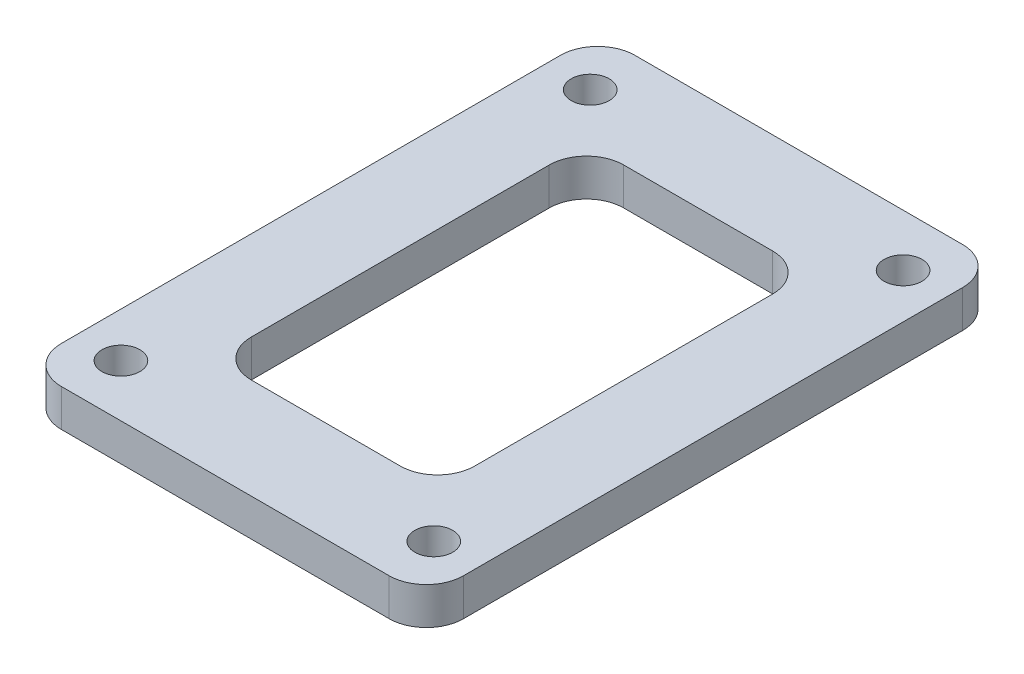
ISO-10303-21;
HEADER;
FILE_DESCRIPTION(('STEP AP214'),'2;1');
FILE_NAME('part.step','',(''),(''),'','','');
FILE_SCHEMA(('AUTOMOTIVE_DESIGN { 1 0 10303 214 1 1 1 1 }'));
ENDSEC;
DATA;
#1=APPLICATION_CONTEXT('core data for automotive mechanical design processes');
#2=APPLICATION_PROTOCOL_DEFINITION('international standard','automotive_design',2000,#1);
#3=PRODUCT_CONTEXT('',#1,'mechanical');
#4=PRODUCT('Part','Part','',(#3));
#5=PRODUCT_RELATED_PRODUCT_CATEGORY('part','',(#4));
#6=PRODUCT_DEFINITION_FORMATION('','',#4);
#7=PRODUCT_DEFINITION_CONTEXT('part definition',#1,'design');
#8=PRODUCT_DEFINITION('design','',#6,#7);
#9=PRODUCT_DEFINITION_SHAPE('','',#8);
#10=(LENGTH_UNIT() NAMED_UNIT(*) SI_UNIT(.MILLI.,.METRE.));
#11=(NAMED_UNIT(*) PLANE_ANGLE_UNIT() SI_UNIT($,.RADIAN.));
#12=(NAMED_UNIT(*) SI_UNIT($,.STERADIAN.) SOLID_ANGLE_UNIT());
#13=UNCERTAINTY_MEASURE_WITH_UNIT(LENGTH_MEASURE(1.E-05),#10,'distance_accuracy_value','');
#14=(GEOMETRIC_REPRESENTATION_CONTEXT(3) GLOBAL_UNCERTAINTY_ASSIGNED_CONTEXT((#13)) GLOBAL_UNIT_ASSIGNED_CONTEXT((#10,
#11,#12)) REPRESENTATION_CONTEXT('',''));
#15=CARTESIAN_POINT('',(0.,0.,0.));
#16=DIRECTION('',(0.,0.,1.));
#17=DIRECTION('',(1.,0.,0.));
#18=AXIS2_PLACEMENT_3D('',#15,#16,#17);
#19=CARTESIAN_POINT('',(27.,5.,-38.5));
#20=DIRECTION('',(-1.,0.,0.));
#21=DIRECTION('',(0.,0.,1.));
#22=AXIS2_PLACEMENT_3D('',#19,#20,#21);
#23=PLANE('',#22);
#24=DIRECTION('',(0.,0.,-1.));
#25=VECTOR('',#24,1.);
#26=CARTESIAN_POINT('',(27.,5.,-38.5));
#27=LINE('',#26,#25);
#28=CARTESIAN_POINT('',(27.,5.,33.5));
#29=VERTEX_POINT('',#28);
#30=CARTESIAN_POINT('',(27.,5.,-33.5));
#31=VERTEX_POINT('',#30);
#32=EDGE_CURVE('E202',#29,#31,#27,.T.);
#33=ORIENTED_EDGE('',*,*,#32,.F.);
#34=DIRECTION('',(0.,-1.,0.));
#35=VECTOR('',#34,1.);
#36=CARTESIAN_POINT('',(27.,5.,33.5));
#37=LINE('',#36,#35);
#38=CARTESIAN_POINT('',(27.,0.,33.5));
#39=VERTEX_POINT('',#38);
#40=EDGE_CURVE('E250',#29,#39,#37,.T.);
#41=ORIENTED_EDGE('',*,*,#40,.T.);
#42=DIRECTION('',(0.,0.,-1.));
#43=VECTOR('',#42,1.);
#44=CARTESIAN_POINT('',(27.,0.,-38.5));
#45=LINE('',#44,#43);
#46=CARTESIAN_POINT('',(27.,0.,-33.5));
#47=VERTEX_POINT('',#46);
#48=EDGE_CURVE('E199',#39,#47,#45,.T.);
#49=ORIENTED_EDGE('',*,*,#48,.T.);
#50=DIRECTION('',(0.,-1.,0.));
#51=VECTOR('',#50,1.);
#52=CARTESIAN_POINT('',(27.,5.,-33.5));
#53=LINE('',#52,#51);
#54=EDGE_CURVE('E248',#47,#31,#53,.F.);
#55=ORIENTED_EDGE('',*,*,#54,.T.);
#56=EDGE_LOOP('',(#33,#41,#49,#55));
#57=FACE_BOUND('',#56,.T.);
#58=ADVANCED_FACE('F37',(#57),#23,.F.);
#59=CARTESIAN_POINT('',(-27.,5.,-38.5));
#60=DIRECTION('',(0.,0.,1.));
#61=DIRECTION('',(1.,0.,0.));
#62=AXIS2_PLACEMENT_3D('',#59,#60,#61);
#63=PLANE('',#62);
#64=DIRECTION('',(-1.,0.,0.));
#65=VECTOR('',#64,1.);
#66=CARTESIAN_POINT('',(-27.,5.,-38.5));
#67=LINE('',#66,#65);
#68=CARTESIAN_POINT('',(22.,5.,-38.5));
#69=VERTEX_POINT('',#68);
#70=CARTESIAN_POINT('',(-22.,5.,-38.5));
#71=VERTEX_POINT('',#70);
#72=EDGE_CURVE('E205',#69,#71,#67,.T.);
#73=ORIENTED_EDGE('',*,*,#72,.F.);
#74=DIRECTION('',(0.,-1.,0.));
#75=VECTOR('',#74,1.);
#76=CARTESIAN_POINT('',(22.,5.,-38.5));
#77=LINE('',#76,#75);
#78=CARTESIAN_POINT('',(22.,0.,-38.5));
#79=VERTEX_POINT('',#78);
#80=EDGE_CURVE('E162',#69,#79,#77,.T.);
#81=ORIENTED_EDGE('',*,*,#80,.T.);
#82=DIRECTION('',(-1.,0.,0.));
#83=VECTOR('',#82,1.);
#84=CARTESIAN_POINT('',(-27.,0.,-38.5));
#85=LINE('',#84,#83);
#86=CARTESIAN_POINT('',(-22.,0.,-38.5));
#87=VERTEX_POINT('',#86);
#88=EDGE_CURVE('E216',#79,#87,#85,.T.);
#89=ORIENTED_EDGE('',*,*,#88,.T.);
#90=DIRECTION('',(0.,-1.,0.));
#91=VECTOR('',#90,1.);
#92=CARTESIAN_POINT('',(-22.,5.,-38.5));
#93=LINE('',#92,#91);
#94=EDGE_CURVE('E277',#87,#71,#93,.F.);
#95=ORIENTED_EDGE('',*,*,#94,.T.);
#96=EDGE_LOOP('',(#73,#81,#89,#95));
#97=FACE_BOUND('',#96,.T.);
#98=ADVANCED_FACE('F335',(#97),#63,.F.);
#99=CARTESIAN_POINT('',(-27.,5.,-38.5));
#100=DIRECTION('',(1.,0.,0.));
#101=DIRECTION('',(0.,0.,-1.));
#102=AXIS2_PLACEMENT_3D('',#99,#100,#101);
#103=PLANE('',#102);
#104=DIRECTION('',(0.,0.,1.));
#105=VECTOR('',#104,1.);
#106=CARTESIAN_POINT('',(-27.,0.,-38.5));
#107=LINE('',#106,#105);
#108=CARTESIAN_POINT('',(-27.,0.,-33.5));
#109=VERTEX_POINT('',#108);
#110=CARTESIAN_POINT('',(-27.,0.,33.5));
#111=VERTEX_POINT('',#110);
#112=EDGE_CURVE('E219',#109,#111,#107,.T.);
#113=ORIENTED_EDGE('',*,*,#112,.T.);
#114=DIRECTION('',(0.,-1.,0.));
#115=VECTOR('',#114,1.);
#116=CARTESIAN_POINT('',(-27.,5.,33.5));
#117=LINE('',#116,#115);
#118=CARTESIAN_POINT('',(-27.,5.,33.5));
#119=VERTEX_POINT('',#118);
#120=EDGE_CURVE('E52',#111,#119,#117,.F.);
#121=ORIENTED_EDGE('',*,*,#120,.T.);
#122=DIRECTION('',(0.,0.,1.));
#123=VECTOR('',#122,1.);
#124=CARTESIAN_POINT('',(-27.,5.,-38.5));
#125=LINE('',#124,#123);
#126=CARTESIAN_POINT('',(-27.,5.,-33.5));
#127=VERTEX_POINT('',#126);
#128=EDGE_CURVE('E208',#127,#119,#125,.T.);
#129=ORIENTED_EDGE('',*,*,#128,.F.);
#130=DIRECTION('',(0.,-1.,0.));
#131=VECTOR('',#130,1.);
#132=CARTESIAN_POINT('',(-27.,5.,-33.5));
#133=LINE('',#132,#131);
#134=EDGE_CURVE('E273',#127,#109,#133,.T.);
#135=ORIENTED_EDGE('',*,*,#134,.T.);
#136=EDGE_LOOP('',(#113,#121,#129,#135));
#137=FACE_BOUND('',#136,.T.);
#138=ADVANCED_FACE('F342',(#137),#103,.F.);
#139=CARTESIAN_POINT('',(-27.,5.,38.5));
#140=DIRECTION('',(0.,0.,-1.));
#141=DIRECTION('',(-1.,0.,0.));
#142=AXIS2_PLACEMENT_3D('',#139,#140,#141);
#143=PLANE('',#142);
#144=DIRECTION('',(1.,0.,0.));
#145=VECTOR('',#144,1.);
#146=CARTESIAN_POINT('',(-27.,0.,38.5));
#147=LINE('',#146,#145);
#148=CARTESIAN_POINT('',(-22.,0.,38.5));
#149=VERTEX_POINT('',#148);
#150=CARTESIAN_POINT('',(22.,0.,38.5));
#151=VERTEX_POINT('',#150);
#152=EDGE_CURVE('E206',#149,#151,#147,.T.);
#153=ORIENTED_EDGE('',*,*,#152,.T.);
#154=DIRECTION('',(0.,-1.,0.));
#155=VECTOR('',#154,1.);
#156=CARTESIAN_POINT('',(22.,5.,38.5));
#157=LINE('',#156,#155);
#158=CARTESIAN_POINT('',(22.,5.,38.5));
#159=VERTEX_POINT('',#158);
#160=EDGE_CURVE('E264',#151,#159,#157,.F.);
#161=ORIENTED_EDGE('',*,*,#160,.T.);
#162=DIRECTION('',(1.,0.,0.));
#163=VECTOR('',#162,1.);
#164=CARTESIAN_POINT('',(-27.,5.,38.5));
#165=LINE('',#164,#163);
#166=CARTESIAN_POINT('',(-22.,5.,38.5));
#167=VERTEX_POINT('',#166);
#168=EDGE_CURVE('E210',#167,#159,#165,.T.);
#169=ORIENTED_EDGE('',*,*,#168,.F.);
#170=DIRECTION('',(0.,-1.,0.));
#171=VECTOR('',#170,1.);
#172=CARTESIAN_POINT('',(-22.,5.,38.5));
#173=LINE('',#172,#171);
#174=EDGE_CURVE('E261',#167,#149,#173,.T.);
#175=ORIENTED_EDGE('',*,*,#174,.T.);
#176=EDGE_LOOP('',(#153,#161,#169,#175));
#177=FACE_BOUND('',#176,.T.);
#178=ADVANCED_FACE('F378',(#177),#143,.F.);
#179=CARTESIAN_POINT('',(0.,5.,0.));
#180=DIRECTION('',(0.,1.,0.));
#181=DIRECTION('',(0.,0.,1.));
#182=AXIS2_PLACEMENT_3D('',#179,#180,#181);
#183=PLANE('',#182);
#184=DIRECTION('',(0.,0.,-1.));
#185=VECTOR('',#184,1.);
#186=CARTESIAN_POINT('',(15.,5.,25.));
#187=LINE('',#186,#185);
#188=CARTESIAN_POINT('',(15.,5.,20.));
#189=VERTEX_POINT('',#188);
#190=CARTESIAN_POINT('',(15.,5.,-20.));
#191=VERTEX_POINT('',#190);
#192=EDGE_CURVE('E298',#189,#191,#187,.T.);
#193=ORIENTED_EDGE('',*,*,#192,.F.);
#194=CARTESIAN_POINT('',(9.99999999999999,5.,20.));
#195=DIRECTION('',(0.,1.,0.));
#196=DIRECTION('',(0.,0.,1.));
#197=AXIS2_PLACEMENT_3D('',#194,#195,#196);
#198=CIRCLE('',#197,5.);
#199=CARTESIAN_POINT('',(9.99999999999999,5.,25.));
#200=VERTEX_POINT('',#199);
#201=EDGE_CURVE('E178',#189,#200,#198,.F.);
#202=ORIENTED_EDGE('',*,*,#201,.T.);
#203=DIRECTION('',(1.,0.,0.));
#204=VECTOR('',#203,1.);
#205=CARTESIAN_POINT('',(-15.,5.,25.));
#206=LINE('',#205,#204);
#207=CARTESIAN_POINT('',(-10.,5.,25.));
#208=VERTEX_POINT('',#207);
#209=EDGE_CURVE('E168',#208,#200,#206,.T.);
#210=ORIENTED_EDGE('',*,*,#209,.F.);
#211=CARTESIAN_POINT('',(-10.,5.,20.));
#212=DIRECTION('',(0.,1.,0.));
#213=DIRECTION('',(0.,0.,1.));
#214=AXIS2_PLACEMENT_3D('',#211,#212,#213);
#215=CIRCLE('',#214,5.);
#216=CARTESIAN_POINT('',(-15.,5.,20.));
#217=VERTEX_POINT('',#216);
#218=EDGE_CURVE('E151',#208,#217,#215,.F.);
#219=ORIENTED_EDGE('',*,*,#218,.T.);
#220=DIRECTION('',(0.,0.,1.));
#221=VECTOR('',#220,1.);
#222=CARTESIAN_POINT('',(-15.,5.,25.));
#223=LINE('',#222,#221);
#224=CARTESIAN_POINT('',(-15.,5.,-20.));
#225=VERTEX_POINT('',#224);
#226=EDGE_CURVE('E180',#225,#217,#223,.T.);
#227=ORIENTED_EDGE('',*,*,#226,.F.);
#228=CARTESIAN_POINT('',(-10.,5.,-20.));
#229=DIRECTION('',(0.,1.,0.));
#230=DIRECTION('',(0.,0.,1.));
#231=AXIS2_PLACEMENT_3D('',#228,#229,#230);
#232=CIRCLE('',#231,5.);
#233=CARTESIAN_POINT('',(-10.,5.,-25.));
#234=VERTEX_POINT('',#233);
#235=EDGE_CURVE('E45',#225,#234,#232,.F.);
#236=ORIENTED_EDGE('',*,*,#235,.T.);
#237=DIRECTION('',(-1.,0.,0.));
#238=VECTOR('',#237,1.);
#239=CARTESIAN_POINT('',(-15.,5.,-25.));
#240=LINE('',#239,#238);
#241=CARTESIAN_POINT('',(9.99999999999999,5.,-25.));
#242=VERTEX_POINT('',#241);
#243=EDGE_CURVE('E185',#242,#234,#240,.T.);
#244=ORIENTED_EDGE('',*,*,#243,.F.);
#245=CARTESIAN_POINT('',(9.99999999999999,5.,-20.));
#246=DIRECTION('',(0.,1.,0.));
#247=DIRECTION('',(0.,0.,1.));
#248=AXIS2_PLACEMENT_3D('',#245,#246,#247);
#249=CIRCLE('',#248,5.);
#250=EDGE_CURVE('E282',#242,#191,#249,.F.);
#251=ORIENTED_EDGE('',*,*,#250,.T.);
#252=EDGE_LOOP('',(#193,#202,#210,#219,#227,#236,#244,#251));
#253=FACE_BOUND('',#252,.T.);
#254=CARTESIAN_POINT('',(21.,5.,-31.5));
#255=DIRECTION('',(0.,1.,0.));
#256=DIRECTION('',(0.,0.,1.));
#257=AXIS2_PLACEMENT_3D('',#254,#255,#256);
#258=CIRCLE('',#257,2.55);
#259=CARTESIAN_POINT('',(21.,5.,-28.95));
#260=VERTEX_POINT('',#259);
#261=EDGE_CURVE('E192',#260,#260,#258,.T.);
#262=ORIENTED_EDGE('',*,*,#261,.F.);
#263=EDGE_LOOP('',(#262));
#264=FACE_BOUND('',#263,.T.);
#265=CARTESIAN_POINT('',(-21.,5.,-31.5));
#266=DIRECTION('',(0.,1.,0.));
#267=DIRECTION('',(0.,0.,1.));
#268=AXIS2_PLACEMENT_3D('',#265,#266,#267);
#269=CIRCLE('',#268,2.55);
#270=CARTESIAN_POINT('',(-21.,5.,-28.95));
#271=VERTEX_POINT('',#270);
#272=EDGE_CURVE('E195',#271,#271,#269,.T.);
#273=ORIENTED_EDGE('',*,*,#272,.F.);
#274=EDGE_LOOP('',(#273));
#275=FACE_BOUND('',#274,.T.);
#276=ORIENTED_EDGE('',*,*,#168,.T.);
#277=CARTESIAN_POINT('',(22.,5.,33.5));
#278=DIRECTION('',(0.,1.,0.));
#279=DIRECTION('',(0.,0.,1.));
#280=AXIS2_PLACEMENT_3D('',#277,#278,#279);
#281=CIRCLE('',#280,5.);
#282=EDGE_CURVE('E271',#159,#29,#281,.T.);
#283=ORIENTED_EDGE('',*,*,#282,.T.);
#284=ORIENTED_EDGE('',*,*,#32,.T.);
#285=CARTESIAN_POINT('',(22.,5.,-33.5));
#286=DIRECTION('',(0.,1.,0.));
#287=DIRECTION('',(0.,0.,1.));
#288=AXIS2_PLACEMENT_3D('',#285,#286,#287);
#289=CIRCLE('',#288,5.);
#290=EDGE_CURVE('E267',#31,#69,#289,.T.);
#291=ORIENTED_EDGE('',*,*,#290,.T.);
#292=ORIENTED_EDGE('',*,*,#72,.T.);
#293=CARTESIAN_POINT('',(-22.,5.,-33.5));
#294=DIRECTION('',(0.,1.,0.));
#295=DIRECTION('',(0.,0.,1.));
#296=AXIS2_PLACEMENT_3D('',#293,#294,#295);
#297=CIRCLE('',#296,5.);
#298=EDGE_CURVE('E59',#71,#127,#297,.T.);
#299=ORIENTED_EDGE('',*,*,#298,.T.);
#300=ORIENTED_EDGE('',*,*,#128,.T.);
#301=CARTESIAN_POINT('',(-22.,5.,33.5));
#302=DIRECTION('',(0.,1.,0.));
#303=DIRECTION('',(0.,0.,1.));
#304=AXIS2_PLACEMENT_3D('',#301,#302,#303);
#305=CIRCLE('',#304,5.);
#306=EDGE_CURVE('E269',#119,#167,#305,.T.);
#307=ORIENTED_EDGE('',*,*,#306,.T.);
#308=EDGE_LOOP('',(#276,#283,#284,#291,#292,#299,#300,#307));
#309=FACE_BOUND('',#308,.T.);
#310=CARTESIAN_POINT('',(-21.,5.,31.5));
#311=DIRECTION('',(0.,1.,0.));
#312=DIRECTION('',(0.,0.,1.));
#313=AXIS2_PLACEMENT_3D('',#310,#311,#312);
#314=CIRCLE('',#313,2.55);
#315=CARTESIAN_POINT('',(-21.,5.,34.05));
#316=VERTEX_POINT('',#315);
#317=EDGE_CURVE('E225',#316,#316,#314,.T.);
#318=ORIENTED_EDGE('',*,*,#317,.F.);
#319=EDGE_LOOP('',(#318));
#320=FACE_BOUND('',#319,.T.);
#321=CARTESIAN_POINT('',(21.,5.,31.5));
#322=DIRECTION('',(0.,1.,0.));
#323=DIRECTION('',(0.,0.,1.));
#324=AXIS2_PLACEMENT_3D('',#321,#322,#323);
#325=CIRCLE('',#324,2.55);
#326=CARTESIAN_POINT('',(21.,5.,34.05));
#327=VERTEX_POINT('',#326);
#328=EDGE_CURVE('E231',#327,#327,#325,.T.);
#329=ORIENTED_EDGE('',*,*,#328,.F.);
#330=EDGE_LOOP('',(#329));
#331=FACE_BOUND('',#330,.T.);
#332=ADVANCED_FACE('F176',(#253,#264,#275,#309,#320,#331),#183,.T.);
#333=CARTESIAN_POINT('',(0.,0.,0.));
#334=DIRECTION('',(0.,1.,0.));
#335=DIRECTION('',(0.,0.,1.));
#336=AXIS2_PLACEMENT_3D('',#333,#334,#335);
#337=PLANE('',#336);
#338=DIRECTION('',(0.,0.,1.));
#339=VECTOR('',#338,1.);
#340=CARTESIAN_POINT('',(-15.,0.,25.));
#341=LINE('',#340,#339);
#342=CARTESIAN_POINT('',(-15.,0.,-20.));
#343=VERTEX_POINT('',#342);
#344=CARTESIAN_POINT('',(-15.,0.,20.));
#345=VERTEX_POINT('',#344);
#346=EDGE_CURVE('E306',#343,#345,#341,.T.);
#347=ORIENTED_EDGE('',*,*,#346,.T.);
#348=CARTESIAN_POINT('',(-10.,0.,20.));
#349=DIRECTION('',(0.,1.,0.));
#350=DIRECTION('',(0.,0.,1.));
#351=AXIS2_PLACEMENT_3D('',#348,#349,#350);
#352=CIRCLE('',#351,5.);
#353=CARTESIAN_POINT('',(-10.,0.,25.));
#354=VERTEX_POINT('',#353);
#355=EDGE_CURVE('E161',#345,#354,#352,.T.);
#356=ORIENTED_EDGE('',*,*,#355,.T.);
#357=DIRECTION('',(1.,0.,0.));
#358=VECTOR('',#357,1.);
#359=CARTESIAN_POINT('',(-15.,0.,25.));
#360=LINE('',#359,#358);
#361=CARTESIAN_POINT('',(9.99999999999999,0.,25.));
#362=VERTEX_POINT('',#361);
#363=EDGE_CURVE('E171',#354,#362,#360,.T.);
#364=ORIENTED_EDGE('',*,*,#363,.T.);
#365=CARTESIAN_POINT('',(9.99999999999999,0.,20.));
#366=DIRECTION('',(0.,1.,0.));
#367=DIRECTION('',(0.,0.,1.));
#368=AXIS2_PLACEMENT_3D('',#365,#366,#367);
#369=CIRCLE('',#368,5.);
#370=CARTESIAN_POINT('',(15.,0.,20.));
#371=VERTEX_POINT('',#370);
#372=EDGE_CURVE('E287',#362,#371,#369,.T.);
#373=ORIENTED_EDGE('',*,*,#372,.T.);
#374=DIRECTION('',(0.,0.,-1.));
#375=VECTOR('',#374,1.);
#376=CARTESIAN_POINT('',(15.,0.,25.));
#377=LINE('',#376,#375);
#378=CARTESIAN_POINT('',(15.,0.,-20.));
#379=VERTEX_POINT('',#378);
#380=EDGE_CURVE('E179',#371,#379,#377,.T.);
#381=ORIENTED_EDGE('',*,*,#380,.T.);
#382=CARTESIAN_POINT('',(9.99999999999999,0.,-20.));
#383=DIRECTION('',(0.,1.,0.));
#384=DIRECTION('',(0.,0.,1.));
#385=AXIS2_PLACEMENT_3D('',#382,#383,#384);
#386=CIRCLE('',#385,5.);
#387=CARTESIAN_POINT('',(9.99999999999999,0.,-25.));
#388=VERTEX_POINT('',#387);
#389=EDGE_CURVE('E284',#379,#388,#386,.T.);
#390=ORIENTED_EDGE('',*,*,#389,.T.);
#391=DIRECTION('',(-1.,0.,0.));
#392=VECTOR('',#391,1.);
#393=CARTESIAN_POINT('',(-15.,0.,-25.));
#394=LINE('',#393,#392);
#395=CARTESIAN_POINT('',(-10.,0.,-25.));
#396=VERTEX_POINT('',#395);
#397=EDGE_CURVE('E183',#388,#396,#394,.T.);
#398=ORIENTED_EDGE('',*,*,#397,.T.);
#399=CARTESIAN_POINT('',(-10.,0.,-20.));
#400=DIRECTION('',(0.,1.,0.));
#401=DIRECTION('',(0.,0.,1.));
#402=AXIS2_PLACEMENT_3D('',#399,#400,#401);
#403=CIRCLE('',#402,5.);
#404=EDGE_CURVE('E11',#396,#343,#403,.T.);
#405=ORIENTED_EDGE('',*,*,#404,.T.);
#406=EDGE_LOOP('',(#347,#356,#364,#373,#381,#390,#398,#405));
#407=FACE_BOUND('',#406,.T.);
#408=CARTESIAN_POINT('',(21.,0.,-31.5));
#409=DIRECTION('',(0.,1.,0.));
#410=DIRECTION('',(0.,0.,1.));
#411=AXIS2_PLACEMENT_3D('',#408,#409,#410);
#412=CIRCLE('',#411,2.55);
#413=CARTESIAN_POINT('',(21.,0.,-28.95));
#414=VERTEX_POINT('',#413);
#415=EDGE_CURVE('E189',#414,#414,#412,.T.);
#416=ORIENTED_EDGE('',*,*,#415,.T.);
#417=EDGE_LOOP('',(#416));
#418=FACE_BOUND('',#417,.T.);
#419=CARTESIAN_POINT('',(-21.,0.,-31.5));
#420=DIRECTION('',(0.,1.,0.));
#421=DIRECTION('',(0.,0.,1.));
#422=AXIS2_PLACEMENT_3D('',#419,#420,#421);
#423=CIRCLE('',#422,2.55);
#424=CARTESIAN_POINT('',(-21.,0.,-28.95));
#425=VERTEX_POINT('',#424);
#426=EDGE_CURVE('E196',#425,#425,#423,.T.);
#427=ORIENTED_EDGE('',*,*,#426,.T.);
#428=EDGE_LOOP('',(#427));
#429=FACE_BOUND('',#428,.T.);
#430=ORIENTED_EDGE('',*,*,#48,.F.);
#431=CARTESIAN_POINT('',(22.,0.,33.5));
#432=DIRECTION('',(0.,1.,0.));
#433=DIRECTION('',(0.,0.,1.));
#434=AXIS2_PLACEMENT_3D('',#431,#432,#433);
#435=CIRCLE('',#434,5.);
#436=EDGE_CURVE('E259',#39,#151,#435,.F.);
#437=ORIENTED_EDGE('',*,*,#436,.T.);
#438=ORIENTED_EDGE('',*,*,#152,.F.);
#439=CARTESIAN_POINT('',(-22.,0.,33.5));
#440=DIRECTION('',(0.,1.,0.));
#441=DIRECTION('',(0.,0.,1.));
#442=AXIS2_PLACEMENT_3D('',#439,#440,#441);
#443=CIRCLE('',#442,5.);
#444=EDGE_CURVE('E257',#149,#111,#443,.F.);
#445=ORIENTED_EDGE('',*,*,#444,.T.);
#446=ORIENTED_EDGE('',*,*,#112,.F.);
#447=CARTESIAN_POINT('',(-22.,0.,-33.5));
#448=DIRECTION('',(0.,1.,0.));
#449=DIRECTION('',(0.,0.,1.));
#450=AXIS2_PLACEMENT_3D('',#447,#448,#449);
#451=CIRCLE('',#450,5.);
#452=EDGE_CURVE('E253',#109,#87,#451,.F.);
#453=ORIENTED_EDGE('',*,*,#452,.T.);
#454=ORIENTED_EDGE('',*,*,#88,.F.);
#455=CARTESIAN_POINT('',(22.,0.,-33.5));
#456=DIRECTION('',(0.,1.,0.));
#457=DIRECTION('',(0.,0.,1.));
#458=AXIS2_PLACEMENT_3D('',#455,#456,#457);
#459=CIRCLE('',#458,5.);
#460=EDGE_CURVE('E255',#79,#47,#459,.F.);
#461=ORIENTED_EDGE('',*,*,#460,.T.);
#462=EDGE_LOOP('',(#430,#437,#438,#445,#446,#453,#454,#461));
#463=FACE_BOUND('',#462,.T.);
#464=CARTESIAN_POINT('',(-21.,0.,31.5));
#465=DIRECTION('',(0.,1.,0.));
#466=DIRECTION('',(0.,0.,1.));
#467=AXIS2_PLACEMENT_3D('',#464,#465,#466);
#468=CIRCLE('',#467,2.55);
#469=CARTESIAN_POINT('',(-21.,0.,34.05));
#470=VERTEX_POINT('',#469);
#471=EDGE_CURVE('E213',#470,#470,#468,.T.);
#472=ORIENTED_EDGE('',*,*,#471,.T.);
#473=EDGE_LOOP('',(#472));
#474=FACE_BOUND('',#473,.T.);
#475=CARTESIAN_POINT('',(21.,0.,31.5));
#476=DIRECTION('',(0.,1.,0.));
#477=DIRECTION('',(0.,0.,1.));
#478=AXIS2_PLACEMENT_3D('',#475,#476,#477);
#479=CIRCLE('',#478,2.55);
#480=CARTESIAN_POINT('',(21.,0.,34.05));
#481=VERTEX_POINT('',#480);
#482=EDGE_CURVE('E228',#481,#481,#479,.T.);
#483=ORIENTED_EDGE('',*,*,#482,.T.);
#484=EDGE_LOOP('',(#483));
#485=FACE_BOUND('',#484,.T.);
#486=ADVANCED_FACE('F304',(#407,#418,#429,#463,#474,#485),#337,.F.);
#487=CARTESIAN_POINT('',(-21.,0.,-31.5));
#488=DIRECTION('',(0.,1.,0.));
#489=DIRECTION('',(0.,0.,1.));
#490=AXIS2_PLACEMENT_3D('',#487,#488,#489);
#491=CYLINDRICAL_SURFACE('',#490,2.55);
#492=ORIENTED_EDGE('',*,*,#426,.F.);
#493=EDGE_LOOP('',(#492));
#494=FACE_BOUND('',#493,.T.);
#495=ORIENTED_EDGE('',*,*,#272,.T.);
#496=EDGE_LOOP('',(#495));
#497=FACE_BOUND('',#496,.T.);
#498=ADVANCED_FACE('F371',(#494,#497),#491,.F.);
#499=CARTESIAN_POINT('',(21.,0.,-31.5));
#500=DIRECTION('',(0.,1.,0.));
#501=DIRECTION('',(0.,0.,1.));
#502=AXIS2_PLACEMENT_3D('',#499,#500,#501);
#503=CYLINDRICAL_SURFACE('',#502,2.55);
#504=ORIENTED_EDGE('',*,*,#415,.F.);
#505=EDGE_LOOP('',(#504));
#506=FACE_BOUND('',#505,.T.);
#507=ORIENTED_EDGE('',*,*,#261,.T.);
#508=EDGE_LOOP('',(#507));
#509=FACE_BOUND('',#508,.T.);
#510=ADVANCED_FACE('F352',(#506,#509),#503,.F.);
#511=CARTESIAN_POINT('',(-21.,0.,31.5));
#512=DIRECTION('',(0.,1.,0.));
#513=DIRECTION('',(0.,0.,1.));
#514=AXIS2_PLACEMENT_3D('',#511,#512,#513);
#515=CYLINDRICAL_SURFACE('',#514,2.55);
#516=ORIENTED_EDGE('',*,*,#471,.F.);
#517=EDGE_LOOP('',(#516));
#518=FACE_BOUND('',#517,.T.);
#519=ORIENTED_EDGE('',*,*,#317,.T.);
#520=EDGE_LOOP('',(#519));
#521=FACE_BOUND('',#520,.T.);
#522=ADVANCED_FACE('F348',(#518,#521),#515,.F.);
#523=CARTESIAN_POINT('',(21.,0.,31.5));
#524=DIRECTION('',(0.,1.,0.));
#525=DIRECTION('',(0.,0.,1.));
#526=AXIS2_PLACEMENT_3D('',#523,#524,#525);
#527=CYLINDRICAL_SURFACE('',#526,2.55);
#528=ORIENTED_EDGE('',*,*,#482,.F.);
#529=EDGE_LOOP('',(#528));
#530=FACE_BOUND('',#529,.T.);
#531=ORIENTED_EDGE('',*,*,#328,.T.);
#532=EDGE_LOOP('',(#531));
#533=FACE_BOUND('',#532,.T.);
#534=ADVANCED_FACE('F351',(#530,#533),#527,.F.);
#535=CARTESIAN_POINT('',(15.,0.,25.));
#536=DIRECTION('',(1.,0.,0.));
#537=DIRECTION('',(0.,0.,-1.));
#538=AXIS2_PLACEMENT_3D('',#535,#536,#537);
#539=PLANE('',#538);
#540=ORIENTED_EDGE('',*,*,#192,.T.);
#541=DIRECTION('',(0.,1.,0.));
#542=VECTOR('',#541,1.);
#543=CARTESIAN_POINT('',(15.,0.,-20.));
#544=LINE('',#543,#542);
#545=EDGE_CURVE('E246',#191,#379,#544,.F.);
#546=ORIENTED_EDGE('',*,*,#545,.T.);
#547=ORIENTED_EDGE('',*,*,#380,.F.);
#548=DIRECTION('',(0.,1.,0.));
#549=VECTOR('',#548,1.);
#550=CARTESIAN_POINT('',(15.,5.,20.));
#551=LINE('',#550,#549);
#552=EDGE_CURVE('E243',#371,#189,#551,.T.);
#553=ORIENTED_EDGE('',*,*,#552,.T.);
#554=EDGE_LOOP('',(#540,#546,#547,#553));
#555=FACE_BOUND('',#554,.T.);
#556=ADVANCED_FACE('F316',(#555),#539,.F.);
#557=CARTESIAN_POINT('',(-15.,0.,25.));
#558=DIRECTION('',(0.,0.,1.));
#559=DIRECTION('',(1.,0.,0.));
#560=AXIS2_PLACEMENT_3D('',#557,#558,#559);
#561=PLANE('',#560);
#562=ORIENTED_EDGE('',*,*,#363,.F.);
#563=DIRECTION('',(0.,1.,0.));
#564=VECTOR('',#563,1.);
#565=CARTESIAN_POINT('',(-10.,5.,25.));
#566=LINE('',#565,#564);
#567=EDGE_CURVE('E155',#354,#208,#566,.T.);
#568=ORIENTED_EDGE('',*,*,#567,.T.);
#569=ORIENTED_EDGE('',*,*,#209,.T.);
#570=DIRECTION('',(0.,1.,0.));
#571=VECTOR('',#570,1.);
#572=CARTESIAN_POINT('',(9.99999999999999,0.,25.));
#573=LINE('',#572,#571);
#574=EDGE_CURVE('E173',#200,#362,#573,.F.);
#575=ORIENTED_EDGE('',*,*,#574,.T.);
#576=EDGE_LOOP('',(#562,#568,#569,#575));
#577=FACE_BOUND('',#576,.T.);
#578=ADVANCED_FACE('F167',(#577),#561,.F.);
#579=CARTESIAN_POINT('',(-15.,0.,25.));
#580=DIRECTION('',(-1.,0.,0.));
#581=DIRECTION('',(0.,0.,1.));
#582=AXIS2_PLACEMENT_3D('',#579,#580,#581);
#583=PLANE('',#582);
#584=ORIENTED_EDGE('',*,*,#226,.T.);
#585=DIRECTION('',(0.,1.,0.));
#586=VECTOR('',#585,1.);
#587=CARTESIAN_POINT('',(-15.,0.,20.));
#588=LINE('',#587,#586);
#589=EDGE_CURVE('E156',#217,#345,#588,.F.);
#590=ORIENTED_EDGE('',*,*,#589,.T.);
#591=ORIENTED_EDGE('',*,*,#346,.F.);
#592=DIRECTION('',(0.,1.,0.));
#593=VECTOR('',#592,1.);
#594=CARTESIAN_POINT('',(-15.,5.,-20.));
#595=LINE('',#594,#593);
#596=EDGE_CURVE('E172',#343,#225,#595,.T.);
#597=ORIENTED_EDGE('',*,*,#596,.T.);
#598=EDGE_LOOP('',(#584,#590,#591,#597));
#599=FACE_BOUND('',#598,.T.);
#600=ADVANCED_FACE('F308',(#599),#583,.F.);
#601=CARTESIAN_POINT('',(-15.,0.,-25.));
#602=DIRECTION('',(0.,0.,-1.));
#603=DIRECTION('',(-1.,0.,0.));
#604=AXIS2_PLACEMENT_3D('',#601,#602,#603);
#605=PLANE('',#604);
#606=ORIENTED_EDGE('',*,*,#397,.F.);
#607=DIRECTION('',(0.,1.,0.));
#608=VECTOR('',#607,1.);
#609=CARTESIAN_POINT('',(9.99999999999999,5.,-25.));
#610=LINE('',#609,#608);
#611=EDGE_CURVE('E240',#388,#242,#610,.T.);
#612=ORIENTED_EDGE('',*,*,#611,.T.);
#613=ORIENTED_EDGE('',*,*,#243,.T.);
#614=DIRECTION('',(0.,1.,0.));
#615=VECTOR('',#614,1.);
#616=CARTESIAN_POINT('',(-10.,0.,-25.));
#617=LINE('',#616,#615);
#618=EDGE_CURVE('E238',#234,#396,#617,.F.);
#619=ORIENTED_EDGE('',*,*,#618,.T.);
#620=EDGE_LOOP('',(#606,#612,#613,#619));
#621=FACE_BOUND('',#620,.T.);
#622=ADVANCED_FACE('F295',(#621),#605,.F.);
#623=CARTESIAN_POINT('',(-10.,0.,20.));
#624=DIRECTION('',(0.,-1.,0.));
#625=DIRECTION('',(0.,0.,-1.));
#626=AXIS2_PLACEMENT_3D('',#623,#624,#625);
#627=CYLINDRICAL_SURFACE('',#626,5.);
#628=ORIENTED_EDGE('',*,*,#355,.F.);
#629=ORIENTED_EDGE('',*,*,#589,.F.);
#630=ORIENTED_EDGE('',*,*,#218,.F.);
#631=ORIENTED_EDGE('',*,*,#567,.F.);
#632=EDGE_LOOP('',(#628,#629,#630,#631));
#633=FACE_BOUND('',#632,.T.);
#634=ADVANCED_FACE('F154',(#633),#627,.F.);
#635=CARTESIAN_POINT('',(9.99999999999999,0.,-20.));
#636=DIRECTION('',(0.,-1.,0.));
#637=DIRECTION('',(0.,0.,-1.));
#638=AXIS2_PLACEMENT_3D('',#635,#636,#637);
#639=CYLINDRICAL_SURFACE('',#638,5.);
#640=ORIENTED_EDGE('',*,*,#389,.F.);
#641=ORIENTED_EDGE('',*,*,#545,.F.);
#642=ORIENTED_EDGE('',*,*,#250,.F.);
#643=ORIENTED_EDGE('',*,*,#611,.F.);
#644=EDGE_LOOP('',(#640,#641,#642,#643));
#645=FACE_BOUND('',#644,.T.);
#646=ADVANCED_FACE('F321',(#645),#639,.F.);
#647=CARTESIAN_POINT('',(9.99999999999999,0.,20.));
#648=DIRECTION('',(0.,-1.,0.));
#649=DIRECTION('',(0.,0.,-1.));
#650=AXIS2_PLACEMENT_3D('',#647,#648,#649);
#651=CYLINDRICAL_SURFACE('',#650,5.);
#652=ORIENTED_EDGE('',*,*,#372,.F.);
#653=ORIENTED_EDGE('',*,*,#574,.F.);
#654=ORIENTED_EDGE('',*,*,#201,.F.);
#655=ORIENTED_EDGE('',*,*,#552,.F.);
#656=EDGE_LOOP('',(#652,#653,#654,#655));
#657=FACE_BOUND('',#656,.T.);
#658=ADVANCED_FACE('F324',(#657),#651,.F.);
#659=CARTESIAN_POINT('',(-10.,0.,-20.));
#660=DIRECTION('',(0.,-1.,0.));
#661=DIRECTION('',(0.,0.,-1.));
#662=AXIS2_PLACEMENT_3D('',#659,#660,#661);
#663=CYLINDRICAL_SURFACE('',#662,5.);
#664=ORIENTED_EDGE('',*,*,#404,.F.);
#665=ORIENTED_EDGE('',*,*,#618,.F.);
#666=ORIENTED_EDGE('',*,*,#235,.F.);
#667=ORIENTED_EDGE('',*,*,#596,.F.);
#668=EDGE_LOOP('',(#664,#665,#666,#667));
#669=FACE_BOUND('',#668,.T.);
#670=ADVANCED_FACE('F300',(#669),#663,.F.);
#671=CARTESIAN_POINT('',(22.,5.,33.5));
#672=DIRECTION('',(0.,-1.,0.));
#673=DIRECTION('',(0.,0.,-1.));
#674=AXIS2_PLACEMENT_3D('',#671,#672,#673);
#675=CYLINDRICAL_SURFACE('',#674,5.);
#676=ORIENTED_EDGE('',*,*,#282,.F.);
#677=ORIENTED_EDGE('',*,*,#160,.F.);
#678=ORIENTED_EDGE('',*,*,#436,.F.);
#679=ORIENTED_EDGE('',*,*,#40,.F.);
#680=EDGE_LOOP('',(#676,#677,#678,#679));
#681=FACE_BOUND('',#680,.T.);
#682=ADVANCED_FACE('F331',(#681),#675,.T.);
#683=CARTESIAN_POINT('',(-22.,5.,33.5));
#684=DIRECTION('',(0.,-1.,0.));
#685=DIRECTION('',(0.,0.,-1.));
#686=AXIS2_PLACEMENT_3D('',#683,#684,#685);
#687=CYLINDRICAL_SURFACE('',#686,5.);
#688=ORIENTED_EDGE('',*,*,#306,.F.);
#689=ORIENTED_EDGE('',*,*,#120,.F.);
#690=ORIENTED_EDGE('',*,*,#444,.F.);
#691=ORIENTED_EDGE('',*,*,#174,.F.);
#692=EDGE_LOOP('',(#688,#689,#690,#691));
#693=FACE_BOUND('',#692,.T.);
#694=ADVANCED_FACE('F391',(#693),#687,.T.);
#695=CARTESIAN_POINT('',(22.,5.,-33.5));
#696=DIRECTION('',(0.,-1.,0.));
#697=DIRECTION('',(0.,0.,-1.));
#698=AXIS2_PLACEMENT_3D('',#695,#696,#697);
#699=CYLINDRICAL_SURFACE('',#698,5.);
#700=ORIENTED_EDGE('',*,*,#290,.F.);
#701=ORIENTED_EDGE('',*,*,#54,.F.);
#702=ORIENTED_EDGE('',*,*,#460,.F.);
#703=ORIENTED_EDGE('',*,*,#80,.F.);
#704=EDGE_LOOP('',(#700,#701,#702,#703));
#705=FACE_BOUND('',#704,.T.);
#706=ADVANCED_FACE('F404',(#705),#699,.T.);
#707=CARTESIAN_POINT('',(-22.,5.,-33.5));
#708=DIRECTION('',(0.,-1.,0.));
#709=DIRECTION('',(0.,0.,-1.));
#710=AXIS2_PLACEMENT_3D('',#707,#708,#709);
#711=CYLINDRICAL_SURFACE('',#710,5.);
#712=ORIENTED_EDGE('',*,*,#298,.F.);
#713=ORIENTED_EDGE('',*,*,#94,.F.);
#714=ORIENTED_EDGE('',*,*,#452,.F.);
#715=ORIENTED_EDGE('',*,*,#134,.F.);
#716=EDGE_LOOP('',(#712,#713,#714,#715));
#717=FACE_BOUND('',#716,.T.);
#718=ADVANCED_FACE('F39',(#717),#711,.T.);
#719=CLOSED_SHELL('',(#58,#98,#138,#178,#332,#486,#498,#510,#522,#534,#556,#578,#600,#622,#634,
#646,#658,#670,#682,#694,#706,#718));
#720=MANIFOLD_SOLID_BREP('B2',#719);
#721=ADVANCED_BREP_SHAPE_REPRESENTATION('',(#18,#720),#14);
#722=SHAPE_DEFINITION_REPRESENTATION(#9,#721);
ENDSEC;
END-ISO-10303-21;
